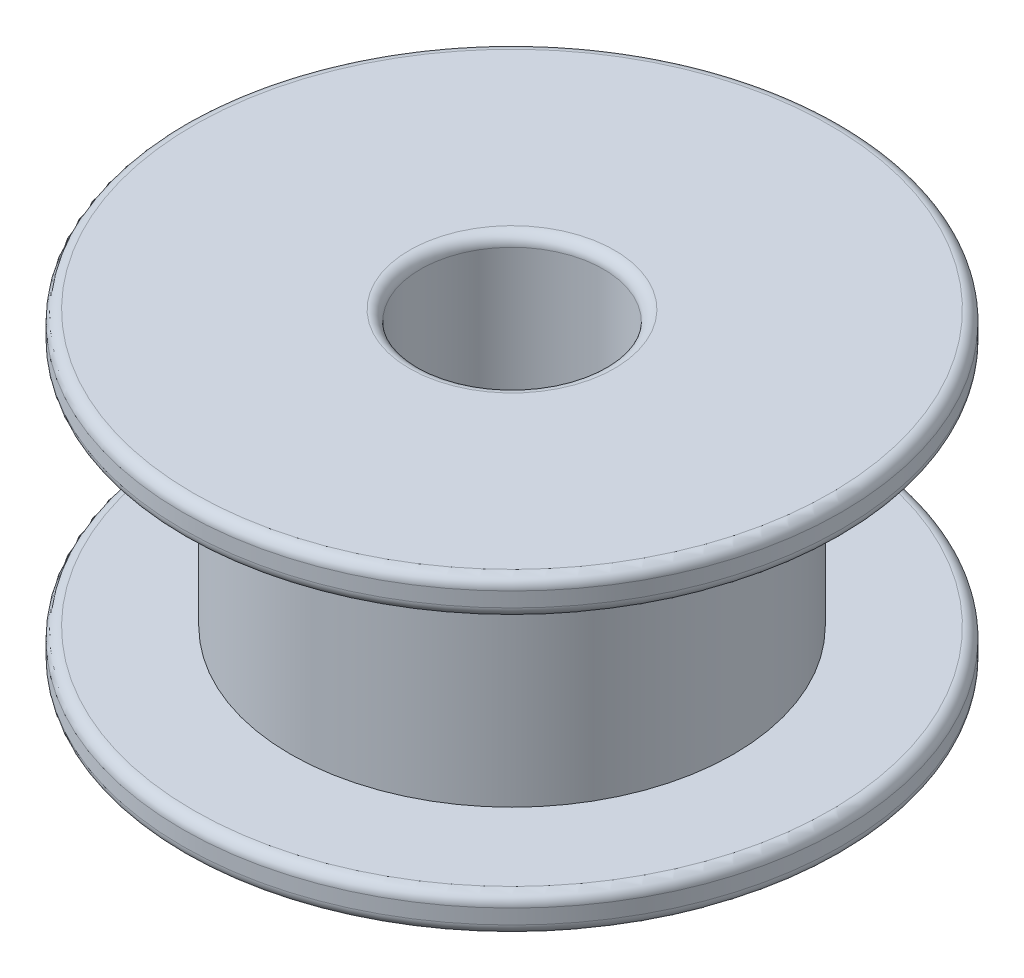
ISO-10303-21;
HEADER;
FILE_DESCRIPTION(('STEP AP214'),'2;1');
FILE_NAME('part.step','',(''),(''),'','','');
FILE_SCHEMA(('AUTOMOTIVE_DESIGN { 1 0 10303 214 1 1 1 1 }'));
ENDSEC;
DATA;
#1=APPLICATION_CONTEXT('core data for automotive mechanical design processes');
#2=APPLICATION_PROTOCOL_DEFINITION('international standard','automotive_design',2000,#1);
#3=PRODUCT_CONTEXT('',#1,'mechanical');
#4=PRODUCT('Part','Part','',(#3));
#5=PRODUCT_RELATED_PRODUCT_CATEGORY('part','',(#4));
#6=PRODUCT_DEFINITION_FORMATION('','',#4);
#7=PRODUCT_DEFINITION_CONTEXT('part definition',#1,'design');
#8=PRODUCT_DEFINITION('design','',#6,#7);
#9=PRODUCT_DEFINITION_SHAPE('','',#8);
#10=(LENGTH_UNIT() NAMED_UNIT(*) SI_UNIT(.MILLI.,.METRE.));
#11=(NAMED_UNIT(*) PLANE_ANGLE_UNIT() SI_UNIT($,.RADIAN.));
#12=(NAMED_UNIT(*) SI_UNIT($,.STERADIAN.) SOLID_ANGLE_UNIT());
#13=UNCERTAINTY_MEASURE_WITH_UNIT(LENGTH_MEASURE(1.E-05),#10,'distance_accuracy_value','');
#14=(GEOMETRIC_REPRESENTATION_CONTEXT(3) GLOBAL_UNCERTAINTY_ASSIGNED_CONTEXT((#13)) GLOBAL_UNIT_ASSIGNED_CONTEXT((#10,
#11,#12)) REPRESENTATION_CONTEXT('',''));
#15=CARTESIAN_POINT('',(0.,0.,0.));
#16=DIRECTION('',(0.,0.,1.));
#17=DIRECTION('',(1.,0.,0.));
#18=AXIS2_PLACEMENT_3D('',#15,#16,#17);
#19=CARTESIAN_POINT('',(0.,1.,0.));
#20=DIRECTION('',(0.,1.,0.));
#21=DIRECTION('',(0.,0.,1.));
#22=AXIS2_PLACEMENT_3D('',#19,#20,#21);
#23=PLANE('',#22);
#24=CARTESIAN_POINT('',(0.,1.,0.));
#25=DIRECTION('',(0.,1.,0.));
#26=DIRECTION('',(0.,0.,1.));
#27=AXIS2_PLACEMENT_3D('',#24,#25,#26);
#28=CIRCLE('',#27,8.7);
#29=CARTESIAN_POINT('',(0.,1.,8.7));
#30=VERTEX_POINT('',#29);
#31=EDGE_CURVE('E10',#30,#30,#28,.T.);
#32=ORIENTED_EDGE('',*,*,#31,.T.);
#33=EDGE_LOOP('',(#32));
#34=FACE_BOUND('',#33,.T.);
#35=CARTESIAN_POINT('',(0.,1.,0.));
#36=DIRECTION('',(0.,1.,0.));
#37=DIRECTION('',(0.,0.,1.));
#38=AXIS2_PLACEMENT_3D('',#35,#36,#37);
#39=CIRCLE('',#38,6.05);
#40=CARTESIAN_POINT('',(0.,1.,-6.05));
#41=VERTEX_POINT('',#40);
#42=EDGE_CURVE('E80',#41,#41,#39,.T.);
#43=ORIENTED_EDGE('',*,*,#42,.F.);
#44=EDGE_LOOP('',(#43));
#45=FACE_BOUND('',#44,.T.);
#46=ADVANCED_FACE('F35',(#34,#45),#23,.T.);
#47=CARTESIAN_POINT('',(0.,0.,0.));
#48=DIRECTION('',(0.,1.,0.));
#49=DIRECTION('',(0.,0.,1.));
#50=AXIS2_PLACEMENT_3D('',#47,#48,#49);
#51=PLANE('',#50);
#52=CARTESIAN_POINT('',(0.,0.,0.));
#53=DIRECTION('',(0.,1.,0.));
#54=DIRECTION('',(0.,0.,1.));
#55=AXIS2_PLACEMENT_3D('',#52,#53,#54);
#56=CIRCLE('',#55,2.8);
#57=CARTESIAN_POINT('',(0.,0.,2.8));
#58=VERTEX_POINT('',#57);
#59=EDGE_CURVE('E73',#58,#58,#56,.T.);
#60=ORIENTED_EDGE('',*,*,#59,.T.);
#61=EDGE_LOOP('',(#60));
#62=FACE_BOUND('',#61,.T.);
#63=CARTESIAN_POINT('',(0.,0.,0.));
#64=DIRECTION('',(0.,1.,0.));
#65=DIRECTION('',(0.,0.,1.));
#66=AXIS2_PLACEMENT_3D('',#63,#64,#65);
#67=CIRCLE('',#66,8.7);
#68=CARTESIAN_POINT('',(0.,0.,8.7));
#69=VERTEX_POINT('',#68);
#70=EDGE_CURVE('E76',#69,#69,#67,.F.);
#71=ORIENTED_EDGE('',*,*,#70,.T.);
#72=EDGE_LOOP('',(#71));
#73=FACE_BOUND('',#72,.T.);
#74=ADVANCED_FACE('F97',(#62,#73),#51,.F.);
#75=CARTESIAN_POINT('',(0.,1.,0.));
#76=DIRECTION('',(0.,-1.,0.));
#77=DIRECTION('',(0.,0.,-1.));
#78=AXIS2_PLACEMENT_3D('',#75,#76,#77);
#79=CYLINDRICAL_SURFACE('',#78,9.);
#80=CARTESIAN_POINT('',(0.,0.3,0.));
#81=DIRECTION('',(0.,1.,0.));
#82=DIRECTION('',(0.,0.,1.));
#83=AXIS2_PLACEMENT_3D('',#80,#81,#82);
#84=CIRCLE('',#83,9.);
#85=CARTESIAN_POINT('',(0.,0.3,9.));
#86=VERTEX_POINT('',#85);
#87=EDGE_CURVE('E61',#86,#86,#84,.T.);
#88=ORIENTED_EDGE('',*,*,#87,.T.);
#89=EDGE_LOOP('',(#88));
#90=FACE_BOUND('',#89,.T.);
#91=CARTESIAN_POINT('',(0.,0.7,0.));
#92=DIRECTION('',(0.,1.,0.));
#93=DIRECTION('',(0.,0.,1.));
#94=AXIS2_PLACEMENT_3D('',#91,#92,#93);
#95=CIRCLE('',#94,9.);
#96=CARTESIAN_POINT('',(0.,0.7,9.));
#97=VERTEX_POINT('',#96);
#98=EDGE_CURVE('E64',#97,#97,#95,.F.);
#99=ORIENTED_EDGE('',*,*,#98,.T.);
#100=EDGE_LOOP('',(#99));
#101=FACE_BOUND('',#100,.T.);
#102=ADVANCED_FACE('F102',(#90,#101),#79,.T.);
#103=CARTESIAN_POINT('',(0.,1.,0.));
#104=DIRECTION('',(0.,-1.,0.));
#105=DIRECTION('',(0.,0.,-1.));
#106=AXIS2_PLACEMENT_3D('',#103,#104,#105);
#107=CYLINDRICAL_SURFACE('',#106,2.5);
#108=CARTESIAN_POINT('',(0.,0.3,0.));
#109=DIRECTION('',(0.,1.,0.));
#110=DIRECTION('',(0.,0.,1.));
#111=AXIS2_PLACEMENT_3D('',#108,#109,#110);
#112=CIRCLE('',#111,2.5);
#113=CARTESIAN_POINT('',(0.,0.3,2.5));
#114=VERTEX_POINT('',#113);
#115=EDGE_CURVE('E67',#114,#114,#112,.F.);
#116=ORIENTED_EDGE('',*,*,#115,.T.);
#117=EDGE_LOOP('',(#116));
#118=FACE_BOUND('',#117,.T.);
#119=CARTESIAN_POINT('',(0.,8.2,0.));
#120=DIRECTION('',(0.,1.,0.));
#121=DIRECTION('',(0.,0.,1.));
#122=AXIS2_PLACEMENT_3D('',#119,#120,#121);
#123=CIRCLE('',#122,2.5);
#124=CARTESIAN_POINT('',(0.,8.2,2.5));
#125=VERTEX_POINT('',#124);
#126=EDGE_CURVE('E70',#125,#125,#123,.T.);
#127=ORIENTED_EDGE('',*,*,#126,.T.);
#128=EDGE_LOOP('',(#127));
#129=FACE_BOUND('',#128,.T.);
#130=ADVANCED_FACE('F92',(#118,#129),#107,.F.);
#131=CARTESIAN_POINT('',(0.,7.5,0.));
#132=DIRECTION('',(0.,-1.,0.));
#133=DIRECTION('',(0.,0.,-1.));
#134=AXIS2_PLACEMENT_3D('',#131,#132,#133);
#135=CYLINDRICAL_SURFACE('',#134,6.05);
#136=CARTESIAN_POINT('',(0.,7.5,0.));
#137=DIRECTION('',(0.,1.,0.));
#138=DIRECTION('',(0.,0.,1.));
#139=AXIS2_PLACEMENT_3D('',#136,#137,#138);
#140=CIRCLE('',#139,6.05);
#141=CARTESIAN_POINT('',(0.,7.5,-6.05));
#142=VERTEX_POINT('',#141);
#143=EDGE_CURVE('E79',#142,#142,#140,.T.);
#144=CARTESIAN_POINT('',(0.,7.5,-6.05));
#145=CARTESIAN_POINT('',(0.,7.43229166666667,-6.05));
#146=CARTESIAN_POINT('',(0.,7.36458333333333,-6.05));
#147=CARTESIAN_POINT('',(0.,7.22916666666667,-6.05));
#148=CARTESIAN_POINT('',(0.,7.16145833333333,-6.05));
#149=CARTESIAN_POINT('',(0.,7.02604166666667,-6.05));
#150=CARTESIAN_POINT('',(0.,6.95833333333333,-6.05));
#151=CARTESIAN_POINT('',(0.,6.82291666666667,-6.05));
#152=CARTESIAN_POINT('',(0.,6.75520833333333,-6.05));
#153=CARTESIAN_POINT('',(0.,6.61979166666667,-6.05));
#154=CARTESIAN_POINT('',(0.,6.55208333333333,-6.05));
#155=CARTESIAN_POINT('',(0.,6.41666666666667,-6.05));
#156=CARTESIAN_POINT('',(0.,6.34895833333333,-6.05));
#157=CARTESIAN_POINT('',(0.,6.21354166666667,-6.05));
#158=CARTESIAN_POINT('',(0.,6.14583333333333,-6.05));
#159=CARTESIAN_POINT('',(0.,6.01041666666667,-6.05));
#160=CARTESIAN_POINT('',(0.,5.94270833333333,-6.05));
#161=CARTESIAN_POINT('',(0.,5.80729166666667,-6.05));
#162=CARTESIAN_POINT('',(0.,5.73958333333333,-6.05));
#163=CARTESIAN_POINT('',(0.,5.60416666666667,-6.05));
#164=CARTESIAN_POINT('',(0.,5.53645833333333,-6.05));
#165=CARTESIAN_POINT('',(0.,5.40104166666667,-6.05));
#166=CARTESIAN_POINT('',(0.,5.33333333333333,-6.05));
#167=CARTESIAN_POINT('',(0.,5.19791666666667,-6.05));
#168=CARTESIAN_POINT('',(0.,5.13020833333333,-6.05));
#169=CARTESIAN_POINT('',(0.,4.99479166666667,-6.05));
#170=CARTESIAN_POINT('',(0.,4.92708333333333,-6.05));
#171=CARTESIAN_POINT('',(0.,4.79166666666667,-6.05));
#172=CARTESIAN_POINT('',(0.,4.72395833333333,-6.05));
#173=CARTESIAN_POINT('',(0.,4.58854166666667,-6.05));
#174=CARTESIAN_POINT('',(0.,4.52083333333333,-6.05));
#175=CARTESIAN_POINT('',(0.,4.38541666666667,-6.05));
#176=CARTESIAN_POINT('',(0.,4.31770833333333,-6.05));
#177=CARTESIAN_POINT('',(0.,4.18229166666667,-6.05));
#178=CARTESIAN_POINT('',(0.,4.11458333333333,-6.05));
#179=CARTESIAN_POINT('',(0.,3.97916666666667,-6.05));
#180=CARTESIAN_POINT('',(0.,3.91145833333333,-6.05));
#181=CARTESIAN_POINT('',(0.,3.77604166666667,-6.05));
#182=CARTESIAN_POINT('',(0.,3.70833333333333,-6.05));
#183=CARTESIAN_POINT('',(0.,3.57291666666667,-6.05));
#184=CARTESIAN_POINT('',(0.,3.50520833333333,-6.05));
#185=CARTESIAN_POINT('',(0.,3.36979166666667,-6.05));
#186=CARTESIAN_POINT('',(0.,3.30208333333333,-6.05));
#187=CARTESIAN_POINT('',(0.,3.16666666666667,-6.05));
#188=CARTESIAN_POINT('',(0.,3.09895833333333,-6.05));
#189=CARTESIAN_POINT('',(0.,2.96354166666667,-6.05));
#190=CARTESIAN_POINT('',(0.,2.89583333333333,-6.05));
#191=CARTESIAN_POINT('',(0.,2.76041666666667,-6.05));
#192=CARTESIAN_POINT('',(0.,2.69270833333333,-6.05));
#193=CARTESIAN_POINT('',(0.,2.55729166666667,-6.05));
#194=CARTESIAN_POINT('',(0.,2.48958333333333,-6.05));
#195=CARTESIAN_POINT('',(0.,2.35416666666667,-6.05));
#196=CARTESIAN_POINT('',(0.,2.28645833333333,-6.05));
#197=CARTESIAN_POINT('',(0.,2.15104166666667,-6.05));
#198=CARTESIAN_POINT('',(0.,2.08333333333333,-6.05));
#199=CARTESIAN_POINT('',(0.,1.94791666666667,-6.05));
#200=CARTESIAN_POINT('',(0.,1.88020833333333,-6.05));
#201=CARTESIAN_POINT('',(0.,1.74479166666667,-6.05));
#202=CARTESIAN_POINT('',(0.,1.67708333333333,-6.05));
#203=CARTESIAN_POINT('',(0.,1.54166666666667,-6.05));
#204=CARTESIAN_POINT('',(0.,1.47395833333333,-6.05));
#205=CARTESIAN_POINT('',(0.,1.33854166666667,-6.05));
#206=CARTESIAN_POINT('',(0.,1.27083333333333,-6.05));
#207=CARTESIAN_POINT('',(0.,1.13541666666667,-6.05));
#208=CARTESIAN_POINT('',(0.,1.06770833333333,-6.05));
#209=CARTESIAN_POINT('',(0.,1.,-6.05));
#210=B_SPLINE_CURVE_WITH_KNOTS('',3,(#144,#145,#146,#147,#148,#149,#150,#151,#152,#153,#154,
#155,#156,#157,#158,#159,#160,#161,#162,#163,#164,#165,#166,#167,#168,#169,#170,#171,#172,#173,
#174,#175,#176,#177,#178,#179,#180,#181,#182,#183,#184,#185,#186,#187,#188,#189,#190,#191,#192,
#193,#194,#195,#196,#197,#198,#199,#200,#201,#202,#203,#204,#205,#206,#207,#208,#209),
.UNSPECIFIED.,.F.,.F.,(4,2,2,2,2,2,2,2,2,2,2,2,2,2,2,2,2,2,2,2,2,2,2,2,2,2,2,2,2,2,2,2,4),(0.,
0.203124999999999,0.40625,0.609375,0.8125,1.015625,1.21875,1.421875,1.625,1.828125,2.03125,
2.234375,2.4375,2.640625,2.84375,3.046875,3.25,3.453125,3.65625,3.859375,4.0625,4.265625,
4.46875,4.671875,4.875,5.078125,5.28125,5.484375,5.6875,5.890625,6.09375,6.296875,6.5),.UNSPECIFIED.);
#211=EDGE_CURVE('BSEAM88',#142,#41,#210,.T.);
#212=ORIENTED_EDGE('',*,*,#143,.F.);
#213=ORIENTED_EDGE('',*,*,#42,.T.);
#214=ORIENTED_EDGE('',*,*,#211,.T.);
#215=ORIENTED_EDGE('',*,*,#211,.F.);
#216=EDGE_LOOP('',(#212,#214,#213,#215));
#217=FACE_BOUND('',#216,.T.);
#218=ADVANCED_FACE('F88',(#217),#135,.T.);
#219=CARTESIAN_POINT('',(0.,8.5,0.));
#220=DIRECTION('',(0.,1.,0.));
#221=DIRECTION('',(0.,0.,1.));
#222=AXIS2_PLACEMENT_3D('',#219,#220,#221);
#223=PLANE('',#222);
#224=CARTESIAN_POINT('',(0.,8.5,0.));
#225=DIRECTION('',(0.,1.,0.));
#226=DIRECTION('',(0.,0.,1.));
#227=AXIS2_PLACEMENT_3D('',#224,#225,#226);
#228=CIRCLE('',#227,2.8);
#229=CARTESIAN_POINT('',(0.,8.5,2.8));
#230=VERTEX_POINT('',#229);
#231=EDGE_CURVE('E55',#230,#230,#228,.F.);
#232=ORIENTED_EDGE('',*,*,#231,.T.);
#233=EDGE_LOOP('',(#232));
#234=FACE_BOUND('',#233,.T.);
#235=CARTESIAN_POINT('',(0.,8.5,0.));
#236=DIRECTION('',(0.,1.,0.));
#237=DIRECTION('',(0.,0.,1.));
#238=AXIS2_PLACEMENT_3D('',#235,#236,#237);
#239=CIRCLE('',#238,8.7);
#240=CARTESIAN_POINT('',(0.,8.5,8.7));
#241=VERTEX_POINT('',#240);
#242=EDGE_CURVE('E58',#241,#241,#239,.T.);
#243=ORIENTED_EDGE('',*,*,#242,.T.);
#244=EDGE_LOOP('',(#243));
#245=FACE_BOUND('',#244,.T.);
#246=ADVANCED_FACE('F91',(#234,#245),#223,.T.);
#247=CARTESIAN_POINT('',(0.,7.5,0.));
#248=DIRECTION('',(0.,1.,0.));
#249=DIRECTION('',(0.,0.,1.));
#250=AXIS2_PLACEMENT_3D('',#247,#248,#249);
#251=PLANE('',#250);
#252=CARTESIAN_POINT('',(0.,7.5,0.));
#253=DIRECTION('',(0.,1.,0.));
#254=DIRECTION('',(0.,0.,1.));
#255=AXIS2_PLACEMENT_3D('',#252,#253,#254);
#256=CIRCLE('',#255,8.7);
#257=CARTESIAN_POINT('',(0.,7.5,8.7));
#258=VERTEX_POINT('',#257);
#259=EDGE_CURVE('E42',#258,#258,#256,.F.);
#260=ORIENTED_EDGE('',*,*,#259,.T.);
#261=EDGE_LOOP('',(#260));
#262=FACE_BOUND('',#261,.T.);
#263=ORIENTED_EDGE('',*,*,#143,.T.);
#264=EDGE_LOOP('',(#263));
#265=FACE_BOUND('',#264,.T.);
#266=ADVANCED_FACE('F86',(#262,#265),#251,.F.);
#267=CARTESIAN_POINT('',(0.,8.5,0.));
#268=DIRECTION('',(0.,-1.,0.));
#269=DIRECTION('',(0.,0.,-1.));
#270=AXIS2_PLACEMENT_3D('',#267,#268,#269);
#271=CYLINDRICAL_SURFACE('',#270,9.);
#272=CARTESIAN_POINT('',(0.,8.2,0.));
#273=DIRECTION('',(0.,1.,0.));
#274=DIRECTION('',(0.,0.,1.));
#275=AXIS2_PLACEMENT_3D('',#272,#273,#274);
#276=CIRCLE('',#275,9.);
#277=CARTESIAN_POINT('',(0.,8.2,9.));
#278=VERTEX_POINT('',#277);
#279=EDGE_CURVE('E46',#278,#278,#276,.F.);
#280=ORIENTED_EDGE('',*,*,#279,.T.);
#281=EDGE_LOOP('',(#280));
#282=FACE_BOUND('',#281,.T.);
#283=CARTESIAN_POINT('',(0.,7.8,0.));
#284=DIRECTION('',(0.,1.,0.));
#285=DIRECTION('',(0.,0.,1.));
#286=AXIS2_PLACEMENT_3D('',#283,#284,#285);
#287=CIRCLE('',#286,9.);
#288=CARTESIAN_POINT('',(0.,7.8,9.));
#289=VERTEX_POINT('',#288);
#290=EDGE_CURVE('E50',#289,#289,#287,.T.);
#291=ORIENTED_EDGE('',*,*,#290,.T.);
#292=EDGE_LOOP('',(#291));
#293=FACE_BOUND('',#292,.T.);
#294=ADVANCED_FACE('F114',(#282,#293),#271,.T.);
#295=CARTESIAN_POINT('',(0.,0.3,0.));
#296=DIRECTION('',(0.,1.,0.));
#297=DIRECTION('',(0.,0.,1.));
#298=AXIS2_PLACEMENT_3D('',#295,#296,#297);
#299=TOROIDAL_SURFACE('',#298,2.8,0.3);
#300=ORIENTED_EDGE('',*,*,#115,.F.);
#301=EDGE_LOOP('',(#300));
#302=FACE_BOUND('',#301,.T.);
#303=ORIENTED_EDGE('',*,*,#59,.F.);
#304=EDGE_LOOP('',(#303));
#305=FACE_BOUND('',#304,.T.);
#306=ADVANCED_FACE('F110',(#302,#305),#299,.T.);
#307=CARTESIAN_POINT('',(0.,0.3,0.));
#308=DIRECTION('',(0.,1.,0.));
#309=DIRECTION('',(0.,0.,1.));
#310=AXIS2_PLACEMENT_3D('',#307,#308,#309);
#311=TOROIDAL_SURFACE('',#310,8.7,0.3);
#312=ORIENTED_EDGE('',*,*,#70,.F.);
#313=EDGE_LOOP('',(#312));
#314=FACE_BOUND('',#313,.T.);
#315=ORIENTED_EDGE('',*,*,#87,.F.);
#316=EDGE_LOOP('',(#315));
#317=FACE_BOUND('',#316,.T.);
#318=ADVANCED_FACE('F113',(#314,#317),#311,.T.);
#319=CARTESIAN_POINT('',(0.,8.2,0.));
#320=DIRECTION('',(0.,1.,0.));
#321=DIRECTION('',(0.,0.,1.));
#322=AXIS2_PLACEMENT_3D('',#319,#320,#321);
#323=TOROIDAL_SURFACE('',#322,2.8,0.3);
#324=ORIENTED_EDGE('',*,*,#231,.F.);
#325=EDGE_LOOP('',(#324));
#326=FACE_BOUND('',#325,.T.);
#327=ORIENTED_EDGE('',*,*,#126,.F.);
#328=EDGE_LOOP('',(#327));
#329=FACE_BOUND('',#328,.T.);
#330=ADVANCED_FACE('F118',(#326,#329),#323,.T.);
#331=CARTESIAN_POINT('',(0.,8.2,0.));
#332=DIRECTION('',(0.,1.,0.));
#333=DIRECTION('',(0.,0.,1.));
#334=AXIS2_PLACEMENT_3D('',#331,#332,#333);
#335=TOROIDAL_SURFACE('',#334,8.7,0.3);
#336=ORIENTED_EDGE('',*,*,#279,.F.);
#337=EDGE_LOOP('',(#336));
#338=FACE_BOUND('',#337,.T.);
#339=ORIENTED_EDGE('',*,*,#242,.F.);
#340=EDGE_LOOP('',(#339));
#341=FACE_BOUND('',#340,.T.);
#342=ADVANCED_FACE('F122',(#338,#341),#335,.T.);
#343=CARTESIAN_POINT('',(0.,7.8,0.));
#344=DIRECTION('',(0.,1.,0.));
#345=DIRECTION('',(0.,0.,1.));
#346=AXIS2_PLACEMENT_3D('',#343,#344,#345);
#347=TOROIDAL_SURFACE('',#346,8.7,0.3);
#348=ORIENTED_EDGE('',*,*,#259,.F.);
#349=EDGE_LOOP('',(#348));
#350=FACE_BOUND('',#349,.T.);
#351=ORIENTED_EDGE('',*,*,#290,.F.);
#352=EDGE_LOOP('',(#351));
#353=FACE_BOUND('',#352,.T.);
#354=ADVANCED_FACE('F125',(#350,#353),#347,.T.);
#355=CARTESIAN_POINT('',(0.,0.7,0.));
#356=DIRECTION('',(0.,1.,0.));
#357=DIRECTION('',(0.,0.,1.));
#358=AXIS2_PLACEMENT_3D('',#355,#356,#357);
#359=TOROIDAL_SURFACE('',#358,8.7,0.3);
#360=ORIENTED_EDGE('',*,*,#98,.F.);
#361=EDGE_LOOP('',(#360));
#362=FACE_BOUND('',#361,.T.);
#363=ORIENTED_EDGE('',*,*,#31,.F.);
#364=EDGE_LOOP('',(#363));
#365=FACE_BOUND('',#364,.T.);
#366=ADVANCED_FACE('F37',(#362,#365),#359,.T.);
#367=CLOSED_SHELL('',(#46,#74,#102,#130,#218,#246,#266,#294,#306,#318,#330,#342,#354,#366));
#368=MANIFOLD_SOLID_BREP('B2',#367);
#369=ADVANCED_BREP_SHAPE_REPRESENTATION('',(#18,#368),#14);
#370=SHAPE_DEFINITION_REPRESENTATION(#9,#369);
ENDSEC;
END-ISO-10303-21;
